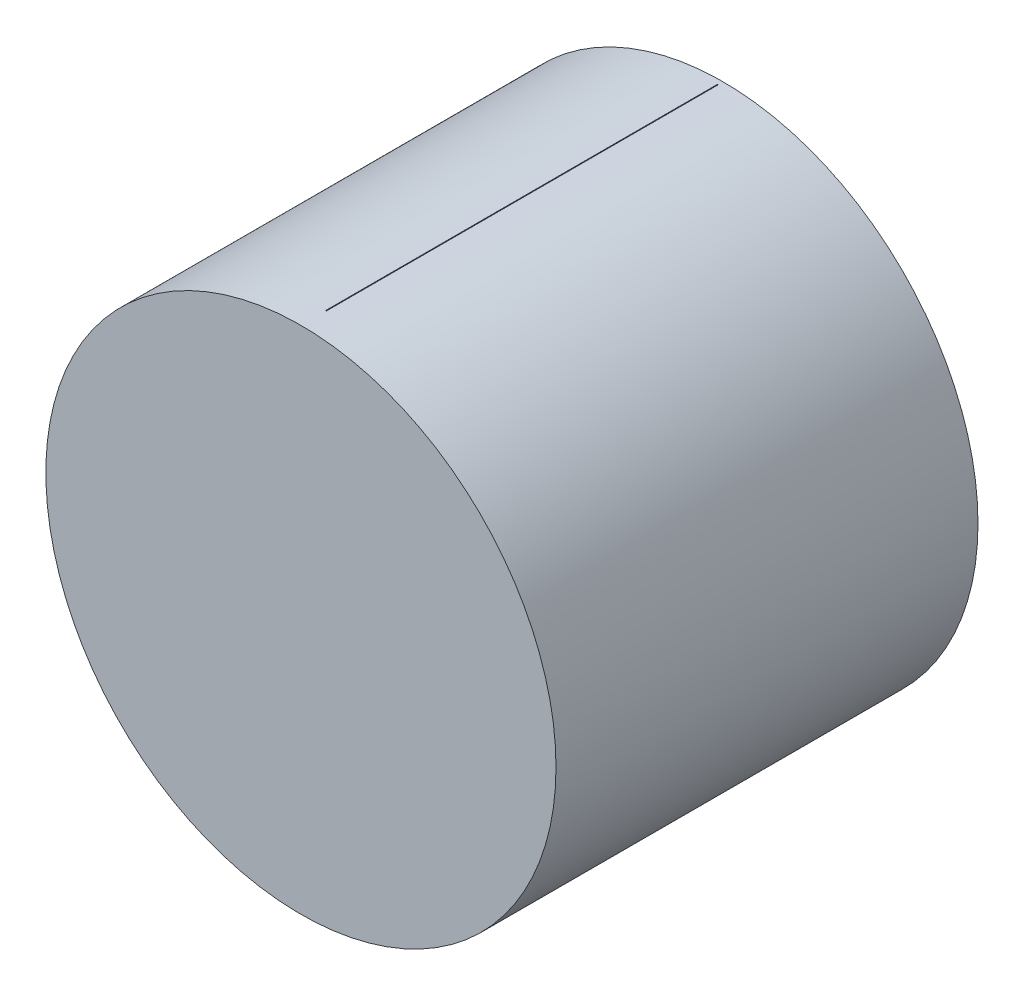
ISO-10303-21;
HEADER;
FILE_DESCRIPTION(('STEP AP214'),'2;1');
FILE_NAME('part.step','',(''),(''),'','','');
FILE_SCHEMA(('AUTOMOTIVE_DESIGN { 1 0 10303 214 1 1 1 1 }'));
ENDSEC;
DATA;
#1=APPLICATION_CONTEXT('core data for automotive mechanical design processes');
#2=APPLICATION_PROTOCOL_DEFINITION('international standard','automotive_design',2000,#1);
#3=PRODUCT_CONTEXT('',#1,'mechanical');
#4=PRODUCT('Part','Part','',(#3));
#5=PRODUCT_RELATED_PRODUCT_CATEGORY('part','',(#4));
#6=PRODUCT_DEFINITION_FORMATION('','',#4);
#7=PRODUCT_DEFINITION_CONTEXT('part definition',#1,'design');
#8=PRODUCT_DEFINITION('design','',#6,#7);
#9=PRODUCT_DEFINITION_SHAPE('','',#8);
#10=(LENGTH_UNIT() NAMED_UNIT(*) SI_UNIT(.MILLI.,.METRE.));
#11=(NAMED_UNIT(*) PLANE_ANGLE_UNIT() SI_UNIT($,.RADIAN.));
#12=(NAMED_UNIT(*) SI_UNIT($,.STERADIAN.) SOLID_ANGLE_UNIT());
#13=UNCERTAINTY_MEASURE_WITH_UNIT(LENGTH_MEASURE(1.E-05),#10,'distance_accuracy_value','');
#14=(GEOMETRIC_REPRESENTATION_CONTEXT(3) GLOBAL_UNCERTAINTY_ASSIGNED_CONTEXT((#13)) GLOBAL_UNIT_ASSIGNED_CONTEXT((#10,
#11,#12)) REPRESENTATION_CONTEXT('',''));
#15=CARTESIAN_POINT('',(0.,0.,0.));
#16=DIRECTION('',(0.,0.,1.));
#17=DIRECTION('',(1.,0.,0.));
#18=AXIS2_PLACEMENT_3D('',#15,#16,#17);
#19=CARTESIAN_POINT('',(0.,0.,-26.));
#20=DIRECTION('',(0.,0.,1.));
#21=DIRECTION('',(1.,0.,0.));
#22=AXIS2_PLACEMENT_3D('',#19,#20,#21);
#23=CYLINDRICAL_SURFACE('',#22,14.925);
#24=CARTESIAN_POINT('',(0.,0.,-26.));
#25=DIRECTION('',(0.,0.,1.));
#26=DIRECTION('',(1.,0.,0.));
#27=AXIS2_PLACEMENT_3D('',#24,#25,#26);
#28=CIRCLE('',#27,14.925);
#29=CARTESIAN_POINT('',(14.925,0.,-26.));
#30=VERTEX_POINT('',#29);
#31=EDGE_CURVE('E124',#30,#30,#28,.T.);
#32=ORIENTED_EDGE('',*,*,#31,.F.);
#33=EDGE_LOOP('',(#32));
#34=FACE_BOUND('',#33,.T.);
#35=DIRECTION('',(0.,0.,1.));
#36=VECTOR('',#35,1.);
#37=CARTESIAN_POINT('',(-0.0290325192911258,14.9249717625469,-26.));
#38=LINE('',#37,#36);
#39=CARTESIAN_POINT('',(-0.0290325192911223,14.9249717625469,0.));
#40=VERTEX_POINT('',#39);
#41=CARTESIAN_POINT('',(-0.0290325192911257,14.9249717625469,-25.6704280103122));
#42=VERTEX_POINT('',#41);
#43=EDGE_CURVE('E119',#40,#42,#38,.F.);
#44=ORIENTED_EDGE('',*,*,#43,.F.);
#45=CARTESIAN_POINT('',(0.,0.,0.));
#46=DIRECTION('',(0.,0.,1.));
#47=DIRECTION('',(1.,0.,0.));
#48=AXIS2_PLACEMENT_3D('',#45,#46,#47);
#49=CIRCLE('',#48,14.925);
#50=CARTESIAN_POINT('',(0.0209674807088808,14.9249852718437,0.));
#51=VERTEX_POINT('',#50);
#52=EDGE_CURVE('E131',#40,#51,#49,.T.);
#53=ORIENTED_EDGE('',*,*,#52,.T.);
#54=DIRECTION('',(0.,0.,1.));
#55=VECTOR('',#54,1.);
#56=CARTESIAN_POINT('',(0.0209674807088774,14.9249852718437,-26.));
#57=LINE('',#56,#55);
#58=CARTESIAN_POINT('',(0.0209674807088774,14.9249852718437,-25.6704280103122));
#59=VERTEX_POINT('',#58);
#60=EDGE_CURVE('E97',#59,#51,#57,.T.);
#61=ORIENTED_EDGE('',*,*,#60,.F.);
#62=CARTESIAN_POINT('',(0.,0.,-25.6704280103122));
#63=DIRECTION('',(0.,0.,1.));
#64=DIRECTION('',(1.,0.,0.));
#65=AXIS2_PLACEMENT_3D('',#62,#63,#64);
#66=CIRCLE('',#65,14.925);
#67=EDGE_CURVE('E122',#42,#59,#66,.F.);
#68=ORIENTED_EDGE('',*,*,#67,.F.);
#69=EDGE_LOOP('',(#44,#53,#61,#68));
#70=FACE_BOUND('',#69,.T.);
#71=ADVANCED_FACE('F33',(#34,#70),#23,.F.);
#72=CARTESIAN_POINT('',(0.,0.,-26.));
#73=DIRECTION('',(0.,0.,1.));
#74=DIRECTION('',(1.,0.,0.));
#75=AXIS2_PLACEMENT_3D('',#72,#73,#74);
#76=CYLINDRICAL_SURFACE('',#75,16.925);
#77=CARTESIAN_POINT('',(0.,0.,-26.));
#78=DIRECTION('',(0.,0.,1.));
#79=DIRECTION('',(1.,0.,0.));
#80=AXIS2_PLACEMENT_3D('',#77,#78,#79);
#81=CIRCLE('',#80,16.925);
#82=CARTESIAN_POINT('',(16.925,0.,-26.));
#83=VERTEX_POINT('',#82);
#84=EDGE_CURVE('E128',#83,#83,#81,.T.);
#85=ORIENTED_EDGE('',*,*,#84,.T.);
#86=EDGE_LOOP('',(#85));
#87=FACE_BOUND('',#86,.T.);
#88=CARTESIAN_POINT('',(0.,0.,2.));
#89=DIRECTION('',(0.,0.,1.));
#90=DIRECTION('',(1.,0.,0.));
#91=AXIS2_PLACEMENT_3D('',#88,#89,#90);
#92=CIRCLE('',#91,16.925);
#93=CARTESIAN_POINT('',(16.925,0.,2.));
#94=VERTEX_POINT('',#93);
#95=EDGE_CURVE('E127',#94,#94,#92,.T.);
#96=ORIENTED_EDGE('',*,*,#95,.F.);
#97=EDGE_LOOP('',(#96));
#98=FACE_BOUND('',#97,.T.);
#99=CARTESIAN_POINT('',(0.,0.,0.329571989687846));
#100=DIRECTION('',(0.,0.,-1.));
#101=DIRECTION('',(-1.,0.,0.));
#102=AXIS2_PLACEMENT_3D('',#99,#100,#101);
#103=CIRCLE('',#102,16.925);
#104=CARTESIAN_POINT('',(0.0209674807088809,16.9249870122477,0.329571989687846));
#105=VERTEX_POINT('',#104);
#106=CARTESIAN_POINT('',(-0.0290325192911223,16.9249750993265,0.329571989687846));
#107=VERTEX_POINT('',#106);
#108=EDGE_CURVE('E11',#105,#107,#103,.F.);
#109=ORIENTED_EDGE('',*,*,#108,.T.);
#110=DIRECTION('',(0.,0.,1.));
#111=VECTOR('',#110,1.);
#112=CARTESIAN_POINT('',(-0.0290325192911258,16.9249750993265,-26.));
#113=LINE('',#112,#111);
#114=CARTESIAN_POINT('',(-0.0290325192911257,16.9249750993265,-25.6704280103122));
#115=VERTEX_POINT('',#114);
#116=EDGE_CURVE('E94',#107,#115,#113,.F.);
#117=ORIENTED_EDGE('',*,*,#116,.T.);
#118=CARTESIAN_POINT('',(0.,0.,-25.6704280103122));
#119=DIRECTION('',(0.,0.,1.));
#120=DIRECTION('',(1.,0.,0.));
#121=AXIS2_PLACEMENT_3D('',#118,#119,#120);
#122=CIRCLE('',#121,16.925);
#123=CARTESIAN_POINT('',(0.0209674807088774,16.9249870122477,-25.6704280103122));
#124=VERTEX_POINT('',#123);
#125=EDGE_CURVE('E41',#115,#124,#122,.F.);
#126=ORIENTED_EDGE('',*,*,#125,.T.);
#127=DIRECTION('',(0.,0.,1.));
#128=VECTOR('',#127,1.);
#129=CARTESIAN_POINT('',(0.0209674807088774,16.9249870122477,-26.));
#130=LINE('',#129,#128);
#131=EDGE_CURVE('E116',#124,#105,#130,.T.);
#132=ORIENTED_EDGE('',*,*,#131,.T.);
#133=EDGE_LOOP('',(#109,#117,#126,#132));
#134=FACE_BOUND('',#133,.T.);
#135=ADVANCED_FACE('F142',(#87,#98,#134),#76,.T.);
#136=CARTESIAN_POINT('',(0.,0.,0.));
#137=DIRECTION('',(0.,0.,1.));
#138=DIRECTION('',(1.,0.,0.));
#139=AXIS2_PLACEMENT_3D('',#136,#137,#138);
#140=PLANE('',#139);
#141=DIRECTION('',(0.,1.,0.));
#142=VECTOR('',#141,1.);
#143=CARTESIAN_POINT('',(-0.0290325192911223,0.,0.));
#144=LINE('',#143,#142);
#145=CARTESIAN_POINT('',(-0.0290325192911223,4.24040023272062,0.));
#146=VERTEX_POINT('',#145);
#147=EDGE_CURVE('E139',#146,#40,#144,.T.);
#148=ORIENTED_EDGE('',*,*,#147,.F.);
#149=DIRECTION('',(1.,0.,0.));
#150=VECTOR('',#149,1.);
#151=CARTESIAN_POINT('',(0.,4.24040023272062,0.));
#152=LINE('',#151,#150);
#153=CARTESIAN_POINT('',(0.0209674807088809,4.24040023272062,0.));
#154=VERTEX_POINT('',#153);
#155=EDGE_CURVE('E103',#146,#154,#152,.T.);
#156=ORIENTED_EDGE('',*,*,#155,.T.);
#157=DIRECTION('',(0.,-1.,0.));
#158=VECTOR('',#157,1.);
#159=CARTESIAN_POINT('',(0.0209674807088808,0.,0.));
#160=LINE('',#159,#158);
#161=EDGE_CURVE('E137',#51,#154,#160,.T.);
#162=ORIENTED_EDGE('',*,*,#161,.F.);
#163=ORIENTED_EDGE('',*,*,#52,.F.);
#164=EDGE_LOOP('',(#148,#156,#162,#163));
#165=FACE_BOUND('',#164,.T.);
#166=ADVANCED_FACE('F35',(#165),#140,.F.);
#167=CARTESIAN_POINT('',(0.,0.,2.));
#168=DIRECTION('',(0.,0.,1.));
#169=DIRECTION('',(1.,0.,0.));
#170=AXIS2_PLACEMENT_3D('',#167,#168,#169);
#171=PLANE('',#170);
#172=ORIENTED_EDGE('',*,*,#95,.T.);
#173=EDGE_LOOP('',(#172));
#174=FACE_BOUND('',#173,.T.);
#175=ADVANCED_FACE('F175',(#174),#171,.T.);
#176=CARTESIAN_POINT('',(0.,0.,-26.));
#177=DIRECTION('',(0.,0.,1.));
#178=DIRECTION('',(1.,0.,0.));
#179=AXIS2_PLACEMENT_3D('',#176,#177,#178);
#180=PLANE('',#179);
#181=ORIENTED_EDGE('',*,*,#31,.T.);
#182=EDGE_LOOP('',(#181));
#183=FACE_BOUND('',#182,.T.);
#184=ORIENTED_EDGE('',*,*,#84,.F.);
#185=EDGE_LOOP('',(#184));
#186=FACE_BOUND('',#185,.T.);
#187=ADVANCED_FACE('F173',(#183,#186),#180,.F.);
#188=CARTESIAN_POINT('',(0.0209674807088774,31.2404002327206,-25.6704280103122));
#189=DIRECTION('',(0.,0.,1.));
#190=DIRECTION('',(1.,0.,0.));
#191=AXIS2_PLACEMENT_3D('',#188,#189,#190);
#192=PLANE('',#191);
#193=ORIENTED_EDGE('',*,*,#67,.T.);
#194=DIRECTION('',(0.,-1.,0.));
#195=VECTOR('',#194,1.);
#196=CARTESIAN_POINT('',(0.0209674807088774,31.2404002327206,-25.6704280103122));
#197=LINE('',#196,#195);
#198=EDGE_CURVE('E48',#124,#59,#197,.T.);
#199=ORIENTED_EDGE('',*,*,#198,.F.);
#200=ORIENTED_EDGE('',*,*,#125,.F.);
#201=DIRECTION('',(0.,-1.,0.));
#202=VECTOR('',#201,1.);
#203=CARTESIAN_POINT('',(-0.0290325192911257,31.2404002327206,-25.6704280103122));
#204=LINE('',#203,#202);
#205=EDGE_CURVE('E108',#115,#42,#204,.T.);
#206=ORIENTED_EDGE('',*,*,#205,.T.);
#207=EDGE_LOOP('',(#193,#199,#200,#206));
#208=FACE_BOUND('',#207,.T.);
#209=ADVANCED_FACE('F143',(#208),#192,.T.);
#210=CARTESIAN_POINT('',(-0.0290325192911257,31.2404002327206,-25.6704280103122));
#211=DIRECTION('',(1.,0.,0.));
#212=DIRECTION('',(0.,0.,-1.));
#213=AXIS2_PLACEMENT_3D('',#210,#211,#212);
#214=PLANE('',#213);
#215=DIRECTION('',(0.,-1.,0.));
#216=VECTOR('',#215,1.);
#217=CARTESIAN_POINT('',(-0.0290325192911223,31.2404002327206,0.329571989687846));
#218=LINE('',#217,#216);
#219=CARTESIAN_POINT('',(-0.0290325192911223,4.24040023272062,0.329571989687846));
#220=VERTEX_POINT('',#219);
#221=EDGE_CURVE('E87',#107,#220,#218,.T.);
#222=ORIENTED_EDGE('',*,*,#221,.T.);
#223=DIRECTION('',(0.,0.,1.));
#224=VECTOR('',#223,1.);
#225=CARTESIAN_POINT('',(-0.0290325192911257,4.24040023272062,-25.6704280103122));
#226=LINE('',#225,#224);
#227=EDGE_CURVE('E90',#146,#220,#226,.T.);
#228=ORIENTED_EDGE('',*,*,#227,.F.);
#229=ORIENTED_EDGE('',*,*,#147,.T.);
#230=ORIENTED_EDGE('',*,*,#43,.T.);
#231=ORIENTED_EDGE('',*,*,#205,.F.);
#232=ORIENTED_EDGE('',*,*,#116,.F.);
#233=EDGE_LOOP('',(#222,#228,#229,#230,#231,#232));
#234=FACE_BOUND('',#233,.T.);
#235=ADVANCED_FACE('F89',(#234),#214,.T.);
#236=CARTESIAN_POINT('',(0.0209674807088774,31.2404002327206,-25.6704280103122));
#237=DIRECTION('',(-1.,0.,0.));
#238=DIRECTION('',(0.,0.,1.));
#239=AXIS2_PLACEMENT_3D('',#236,#237,#238);
#240=PLANE('',#239);
#241=ORIENTED_EDGE('',*,*,#198,.T.);
#242=ORIENTED_EDGE('',*,*,#60,.T.);
#243=ORIENTED_EDGE('',*,*,#161,.T.);
#244=DIRECTION('',(0.,0.,-1.));
#245=VECTOR('',#244,1.);
#246=CARTESIAN_POINT('',(0.0209674807088774,4.24040023272062,-25.6704280103122));
#247=LINE('',#246,#245);
#248=CARTESIAN_POINT('',(0.0209674807088809,4.24040023272062,0.329571989687846));
#249=VERTEX_POINT('',#248);
#250=EDGE_CURVE('E56',#249,#154,#247,.T.);
#251=ORIENTED_EDGE('',*,*,#250,.F.);
#252=DIRECTION('',(0.,-1.,0.));
#253=VECTOR('',#252,1.);
#254=CARTESIAN_POINT('',(0.0209674807088809,31.2404002327206,0.329571989687846));
#255=LINE('',#254,#253);
#256=EDGE_CURVE('E98',#105,#249,#255,.T.);
#257=ORIENTED_EDGE('',*,*,#256,.F.);
#258=ORIENTED_EDGE('',*,*,#131,.F.);
#259=EDGE_LOOP('',(#241,#242,#243,#251,#257,#258));
#260=FACE_BOUND('',#259,.T.);
#261=ADVANCED_FACE('F152',(#260),#240,.T.);
#262=CARTESIAN_POINT('',(0.,4.24040023272062,0.));
#263=DIRECTION('',(0.,-1.,0.));
#264=DIRECTION('',(0.,0.,-1.));
#265=AXIS2_PLACEMENT_3D('',#262,#263,#264);
#266=PLANE('',#265);
#267=ORIENTED_EDGE('',*,*,#227,.T.);
#268=DIRECTION('',(1.,0.,0.));
#269=VECTOR('',#268,1.);
#270=CARTESIAN_POINT('',(0.0209674807088809,4.24040023272062,0.329571989687846));
#271=LINE('',#270,#269);
#272=EDGE_CURVE('E101',#220,#249,#271,.T.);
#273=ORIENTED_EDGE('',*,*,#272,.T.);
#274=ORIENTED_EDGE('',*,*,#250,.T.);
#275=ORIENTED_EDGE('',*,*,#155,.F.);
#276=EDGE_LOOP('',(#267,#273,#274,#275));
#277=FACE_BOUND('',#276,.T.);
#278=ADVANCED_FACE('F100',(#277),#266,.F.);
#279=CARTESIAN_POINT('',(0.0209674807088809,31.2404002327206,0.329571989687846));
#280=DIRECTION('',(0.,0.,-1.));
#281=DIRECTION('',(-1.,0.,0.));
#282=AXIS2_PLACEMENT_3D('',#279,#280,#281);
#283=PLANE('',#282);
#284=ORIENTED_EDGE('',*,*,#256,.T.);
#285=ORIENTED_EDGE('',*,*,#272,.F.);
#286=ORIENTED_EDGE('',*,*,#221,.F.);
#287=ORIENTED_EDGE('',*,*,#108,.F.);
#288=EDGE_LOOP('',(#284,#285,#286,#287));
#289=FACE_BOUND('',#288,.T.);
#290=ADVANCED_FACE('F105',(#289),#283,.T.);
#291=CLOSED_SHELL('',(#71,#135,#166,#175,#187,#209,#235,#261,#278,#290));
#292=MANIFOLD_SOLID_BREP('B2',#291);
#293=ADVANCED_BREP_SHAPE_REPRESENTATION('',(#18,#292),#14);
#294=SHAPE_DEFINITION_REPRESENTATION(#9,#293);
ENDSEC;
END-ISO-10303-21;
